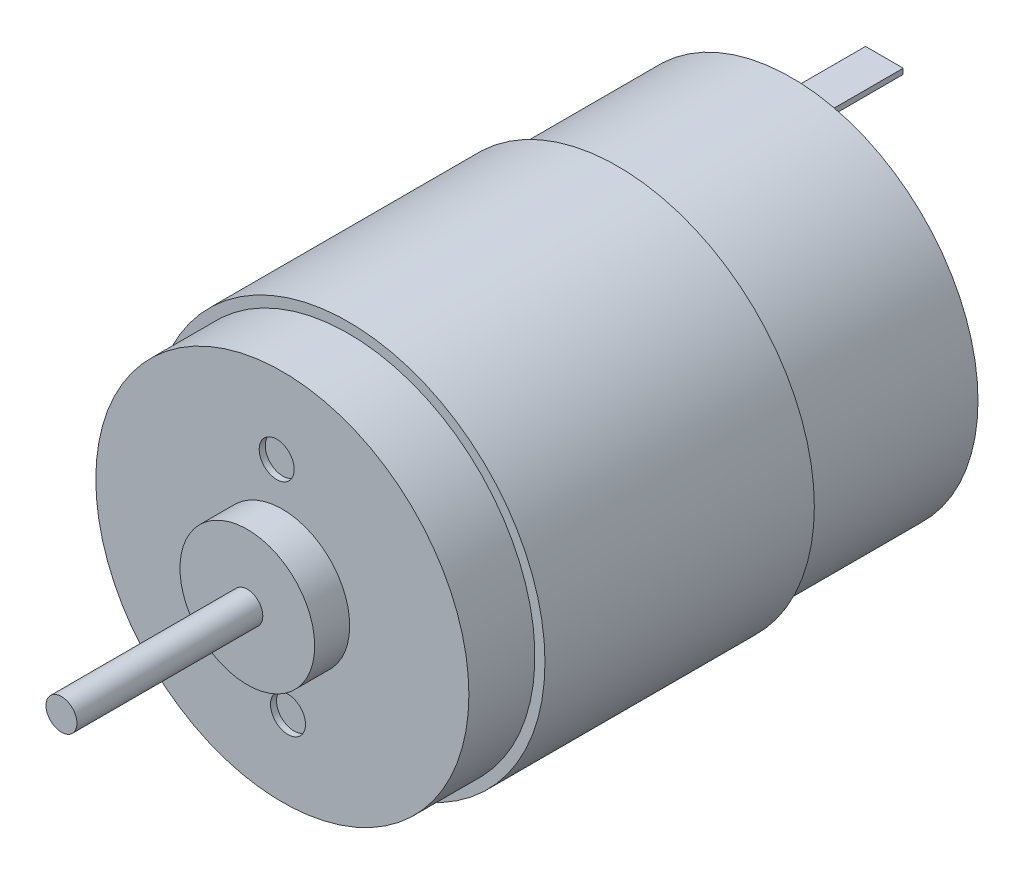
ISO-10303-21;
HEADER;
FILE_DESCRIPTION(('STEP AP214'),'2;1');
FILE_NAME('part.step','',(''),(''),'','','');
FILE_SCHEMA(('AUTOMOTIVE_DESIGN { 1 0 10303 214 1 1 1 1 }'));
ENDSEC;
DATA;
#1=APPLICATION_CONTEXT('core data for automotive mechanical design processes');
#2=APPLICATION_PROTOCOL_DEFINITION('international standard','automotive_design',2000,#1);
#3=PRODUCT_CONTEXT('',#1,'mechanical');
#4=PRODUCT('Part','Part','',(#3));
#5=PRODUCT_RELATED_PRODUCT_CATEGORY('part','',(#4));
#6=PRODUCT_DEFINITION_FORMATION('','',#4);
#7=PRODUCT_DEFINITION_CONTEXT('part definition',#1,'design');
#8=PRODUCT_DEFINITION('design','',#6,#7);
#9=PRODUCT_DEFINITION_SHAPE('','',#8);
#10=(LENGTH_UNIT() NAMED_UNIT(*) SI_UNIT(.MILLI.,.METRE.));
#11=(NAMED_UNIT(*) PLANE_ANGLE_UNIT() SI_UNIT($,.RADIAN.));
#12=(NAMED_UNIT(*) SI_UNIT($,.STERADIAN.) SOLID_ANGLE_UNIT());
#13=UNCERTAINTY_MEASURE_WITH_UNIT(LENGTH_MEASURE(1.E-05),#10,'distance_accuracy_value','');
#14=(GEOMETRIC_REPRESENTATION_CONTEXT(3) GLOBAL_UNCERTAINTY_ASSIGNED_CONTEXT((#13)) GLOBAL_UNIT_ASSIGNED_CONTEXT((#10,
#11,#12)) REPRESENTATION_CONTEXT('',''));
#15=CARTESIAN_POINT('',(0.,0.,0.));
#16=DIRECTION('',(0.,0.,1.));
#17=DIRECTION('',(1.,0.,0.));
#18=AXIS2_PLACEMENT_3D('',#15,#16,#17);
#19=CARTESIAN_POINT('',(0.,0.,0.));
#20=DIRECTION('',(0.,0.,1.));
#21=DIRECTION('',(1.,0.,0.));
#22=AXIS2_PLACEMENT_3D('',#19,#20,#21);
#23=PLANE('',#22);
#24=DIRECTION('',(0.,-1.,0.));
#25=VECTOR('',#24,1.);
#26=CARTESIAN_POINT('',(1.40000000000001,11.7,0.));
#27=LINE('',#26,#25);
#28=CARTESIAN_POINT('',(1.40000000000001,11.7,0.));
#29=VERTEX_POINT('',#28);
#30=CARTESIAN_POINT('',(1.40000000000001,11.3,0.));
#31=VERTEX_POINT('',#30);
#32=EDGE_CURVE('E121',#29,#31,#27,.T.);
#33=ORIENTED_EDGE('',*,*,#32,.F.);
#34=DIRECTION('',(1.,0.,0.));
#35=VECTOR('',#34,1.);
#36=CARTESIAN_POINT('',(1.40000000000001,11.7,0.));
#37=LINE('',#36,#35);
#38=CARTESIAN_POINT('',(-1.39999999999999,11.7,0.));
#39=VERTEX_POINT('',#38);
#40=EDGE_CURVE('E134',#39,#29,#37,.T.);
#41=ORIENTED_EDGE('',*,*,#40,.F.);
#42=DIRECTION('',(0.,1.,0.));
#43=VECTOR('',#42,1.);
#44=CARTESIAN_POINT('',(-1.39999999999999,11.7,0.));
#45=LINE('',#44,#43);
#46=CARTESIAN_POINT('',(-1.39999999999999,11.3,0.));
#47=VERTEX_POINT('',#46);
#48=EDGE_CURVE('E143',#47,#39,#45,.T.);
#49=ORIENTED_EDGE('',*,*,#48,.F.);
#50=DIRECTION('',(-1.,0.,0.));
#51=VECTOR('',#50,1.);
#52=CARTESIAN_POINT('',(1.40000000000001,11.3,0.));
#53=LINE('',#52,#51);
#54=EDGE_CURVE('E124',#31,#47,#53,.T.);
#55=ORIENTED_EDGE('',*,*,#54,.F.);
#56=EDGE_LOOP('',(#33,#41,#49,#55));
#57=FACE_BOUND('',#56,.T.);
#58=CARTESIAN_POINT('',(0.,0.,0.));
#59=DIRECTION('',(0.,0.,-1.));
#60=DIRECTION('',(-1.,0.,0.));
#61=AXIS2_PLACEMENT_3D('',#58,#59,#60);
#62=CIRCLE('',#61,5.);
#63=CARTESIAN_POINT('',(-5.,0.,0.));
#64=VERTEX_POINT('',#63);
#65=EDGE_CURVE('E11',#64,#64,#62,.T.);
#66=ORIENTED_EDGE('',*,*,#65,.F.);
#67=EDGE_LOOP('',(#66));
#68=FACE_BOUND('',#67,.T.);
#69=CARTESIAN_POINT('',(0.,0.,0.));
#70=DIRECTION('',(0.,0.,1.));
#71=DIRECTION('',(1.,0.,0.));
#72=AXIS2_PLACEMENT_3D('',#69,#70,#71);
#73=CIRCLE('',#72,13.85);
#74=CARTESIAN_POINT('',(13.85,0.,0.));
#75=VERTEX_POINT('',#74);
#76=EDGE_CURVE('E175',#75,#75,#73,.T.);
#77=ORIENTED_EDGE('',*,*,#76,.F.);
#78=EDGE_LOOP('',(#77));
#79=FACE_BOUND('',#78,.T.);
#80=DIRECTION('',(0.,-1.,0.));
#81=VECTOR('',#80,1.);
#82=CARTESIAN_POINT('',(1.4,-11.7,0.));
#83=LINE('',#82,#81);
#84=CARTESIAN_POINT('',(1.4,-11.3,0.));
#85=VERTEX_POINT('',#84);
#86=CARTESIAN_POINT('',(1.4,-11.7,0.));
#87=VERTEX_POINT('',#86);
#88=EDGE_CURVE('E120',#85,#87,#83,.T.);
#89=ORIENTED_EDGE('',*,*,#88,.F.);
#90=DIRECTION('',(1.,0.,0.));
#91=VECTOR('',#90,1.);
#92=CARTESIAN_POINT('',(1.4,-11.3,0.));
#93=LINE('',#92,#91);
#94=CARTESIAN_POINT('',(-1.4,-11.3,0.));
#95=VERTEX_POINT('',#94);
#96=EDGE_CURVE('E117',#95,#85,#93,.T.);
#97=ORIENTED_EDGE('',*,*,#96,.F.);
#98=DIRECTION('',(0.,1.,0.));
#99=VECTOR('',#98,1.);
#100=CARTESIAN_POINT('',(-1.4,-11.7,0.));
#101=LINE('',#100,#99);
#102=CARTESIAN_POINT('',(-1.4,-11.7,0.));
#103=VERTEX_POINT('',#102);
#104=EDGE_CURVE('E55',#103,#95,#101,.T.);
#105=ORIENTED_EDGE('',*,*,#104,.F.);
#106=DIRECTION('',(-1.,0.,0.));
#107=VECTOR('',#106,1.);
#108=CARTESIAN_POINT('',(1.4,-11.7,0.));
#109=LINE('',#108,#107);
#110=EDGE_CURVE('E50',#87,#103,#109,.T.);
#111=ORIENTED_EDGE('',*,*,#110,.F.);
#112=EDGE_LOOP('',(#89,#97,#105,#111));
#113=FACE_BOUND('',#112,.T.);
#114=ADVANCED_FACE('F33',(#57,#68,#79,#113),#23,.F.);
#115=CARTESIAN_POINT('',(0.,0.,37.8));
#116=DIRECTION('',(0.,0.,-1.));
#117=DIRECTION('',(-1.,0.,0.));
#118=AXIS2_PLACEMENT_3D('',#115,#116,#117);
#119=CYLINDRICAL_SURFACE('',#118,13.85);
#120=CARTESIAN_POINT('',(0.,0.,37.8));
#121=DIRECTION('',(0.,0.,1.));
#122=DIRECTION('',(1.,0.,0.));
#123=AXIS2_PLACEMENT_3D('',#120,#121,#122);
#124=CIRCLE('',#123,13.85);
#125=CARTESIAN_POINT('',(13.85,0.,37.8));
#126=VERTEX_POINT('',#125);
#127=EDGE_CURVE('E179',#126,#126,#124,.T.);
#128=ORIENTED_EDGE('',*,*,#127,.F.);
#129=EDGE_LOOP('',(#128));
#130=FACE_BOUND('',#129,.T.);
#131=CARTESIAN_POINT('',(0.,0.,32.9));
#132=DIRECTION('',(0.,0.,-1.));
#133=DIRECTION('',(-1.,0.,0.));
#134=AXIS2_PLACEMENT_3D('',#131,#132,#133);
#135=CIRCLE('',#134,13.85);
#136=CARTESIAN_POINT('',(-13.85,0.,32.9));
#137=VERTEX_POINT('',#136);
#138=EDGE_CURVE('E42',#137,#137,#135,.T.);
#139=ORIENTED_EDGE('',*,*,#138,.F.);
#140=EDGE_LOOP('',(#139));
#141=FACE_BOUND('',#140,.T.);
#142=ADVANCED_FACE('F191',(#130,#141),#119,.T.);
#143=CARTESIAN_POINT('',(0.,0.,37.8));
#144=DIRECTION('',(0.,0.,1.));
#145=DIRECTION('',(1.,0.,0.));
#146=AXIS2_PLACEMENT_3D('',#143,#144,#145);
#147=PLANE('',#146);
#148=CARTESIAN_POINT('',(-0.418687649943556,7.98903627803659,37.8));
#149=DIRECTION('',(0.,0.,1.));
#150=DIRECTION('',(1.,0.,0.));
#151=AXIS2_PLACEMENT_3D('',#148,#149,#150);
#152=CIRCLE('',#151,1.3);
#153=CARTESIAN_POINT('',(0.881312350056444,7.98903627803659,37.8));
#154=VERTEX_POINT('',#153);
#155=EDGE_CURVE('E242',#154,#154,#152,.T.);
#156=ORIENTED_EDGE('',*,*,#155,.F.);
#157=EDGE_LOOP('',(#156));
#158=FACE_BOUND('',#157,.T.);
#159=CARTESIAN_POINT('',(0.418687649943557,-7.98903627803659,37.8));
#160=DIRECTION('',(0.,0.,1.));
#161=DIRECTION('',(-1.,0.,0.));
#162=AXIS2_PLACEMENT_3D('',#159,#160,#161);
#163=CIRCLE('',#162,1.3);
#164=CARTESIAN_POINT('',(-0.881312350056447,-7.98903627803659,37.8));
#165=VERTEX_POINT('',#164);
#166=EDGE_CURVE('E236',#165,#165,#163,.T.);
#167=ORIENTED_EDGE('',*,*,#166,.F.);
#168=EDGE_LOOP('',(#167));
#169=FACE_BOUND('',#168,.T.);
#170=CARTESIAN_POINT('',(0.,0.,37.8));
#171=DIRECTION('',(0.,0.,1.));
#172=DIRECTION('',(1.,0.,0.));
#173=AXIS2_PLACEMENT_3D('',#170,#171,#172);
#174=CIRCLE('',#173,5.);
#175=CARTESIAN_POINT('',(5.,0.,37.8));
#176=VERTEX_POINT('',#175);
#177=EDGE_CURVE('E176',#176,#176,#174,.T.);
#178=ORIENTED_EDGE('',*,*,#177,.F.);
#179=EDGE_LOOP('',(#178));
#180=FACE_BOUND('',#179,.T.);
#181=ORIENTED_EDGE('',*,*,#127,.T.);
#182=EDGE_LOOP('',(#181));
#183=FACE_BOUND('',#182,.T.);
#184=ADVANCED_FACE('F193',(#158,#169,#180,#183),#147,.T.);
#185=CARTESIAN_POINT('',(0.,0.,40.4));
#186=DIRECTION('',(0.,0.,-1.));
#187=DIRECTION('',(-1.,0.,0.));
#188=AXIS2_PLACEMENT_3D('',#185,#186,#187);
#189=CYLINDRICAL_SURFACE('',#188,5.);
#190=CARTESIAN_POINT('',(0.,0.,40.4));
#191=DIRECTION('',(0.,0.,1.));
#192=DIRECTION('',(1.,0.,0.));
#193=AXIS2_PLACEMENT_3D('',#190,#191,#192);
#194=CIRCLE('',#193,5.);
#195=CARTESIAN_POINT('',(5.,0.,40.4));
#196=VERTEX_POINT('',#195);
#197=EDGE_CURVE('E172',#196,#196,#194,.T.);
#198=ORIENTED_EDGE('',*,*,#197,.F.);
#199=EDGE_LOOP('',(#198));
#200=FACE_BOUND('',#199,.T.);
#201=ORIENTED_EDGE('',*,*,#177,.T.);
#202=EDGE_LOOP('',(#201));
#203=FACE_BOUND('',#202,.T.);
#204=ADVANCED_FACE('F199',(#200,#203),#189,.T.);
#205=CARTESIAN_POINT('',(0.,0.,40.4));
#206=DIRECTION('',(0.,0.,1.));
#207=DIRECTION('',(1.,0.,0.));
#208=AXIS2_PLACEMENT_3D('',#205,#206,#207);
#209=PLANE('',#208);
#210=CARTESIAN_POINT('',(0.,0.,40.4));
#211=DIRECTION('',(0.,0.,1.));
#212=DIRECTION('',(1.,0.,0.));
#213=AXIS2_PLACEMENT_3D('',#210,#211,#212);
#214=CIRCLE('',#213,1.15);
#215=CARTESIAN_POINT('',(1.15,0.,40.4));
#216=VERTEX_POINT('',#215);
#217=EDGE_CURVE('E171',#216,#216,#214,.F.);
#218=ORIENTED_EDGE('',*,*,#217,.T.);
#219=EDGE_LOOP('',(#218));
#220=FACE_BOUND('',#219,.T.);
#221=ORIENTED_EDGE('',*,*,#197,.T.);
#222=EDGE_LOOP('',(#221));
#223=FACE_BOUND('',#222,.T.);
#224=ADVANCED_FACE('F263',(#220,#223),#209,.T.);
#225=CARTESIAN_POINT('',(0.,0.,54.2));
#226=DIRECTION('',(0.,0.,-1.));
#227=DIRECTION('',(-1.,0.,0.));
#228=AXIS2_PLACEMENT_3D('',#225,#226,#227);
#229=CYLINDRICAL_SURFACE('',#228,1.15);
#230=ORIENTED_EDGE('',*,*,#217,.F.);
#231=EDGE_LOOP('',(#230));
#232=FACE_BOUND('',#231,.T.);
#233=CARTESIAN_POINT('',(0.,0.,54.2));
#234=DIRECTION('',(0.,0.,1.));
#235=DIRECTION('',(1.,0.,0.));
#236=AXIS2_PLACEMENT_3D('',#233,#234,#235);
#237=CIRCLE('',#236,1.15);
#238=CARTESIAN_POINT('',(1.15,0.,54.2));
#239=VERTEX_POINT('',#238);
#240=EDGE_CURVE('E168',#239,#239,#237,.T.);
#241=ORIENTED_EDGE('',*,*,#240,.F.);
#242=EDGE_LOOP('',(#241));
#243=FACE_BOUND('',#242,.T.);
#244=ADVANCED_FACE('F269',(#232,#243),#229,.T.);
#245=CARTESIAN_POINT('',(0.,0.,54.2));
#246=DIRECTION('',(0.,0.,1.));
#247=DIRECTION('',(1.,0.,0.));
#248=AXIS2_PLACEMENT_3D('',#245,#246,#247);
#249=PLANE('',#248);
#250=ORIENTED_EDGE('',*,*,#240,.T.);
#251=EDGE_LOOP('',(#250));
#252=FACE_BOUND('',#251,.T.);
#253=ADVANCED_FACE('F276',(#252),#249,.T.);
#254=CARTESIAN_POINT('',(0.,0.,12.9));
#255=DIRECTION('',(0.,0.,1.));
#256=DIRECTION('',(1.,0.,0.));
#257=AXIS2_PLACEMENT_3D('',#254,#255,#256);
#258=CYLINDRICAL_SURFACE('',#257,14.6);
#259=CARTESIAN_POINT('',(0.,0.,12.9));
#260=DIRECTION('',(0.,0.,-1.));
#261=DIRECTION('',(-1.,0.,0.));
#262=AXIS2_PLACEMENT_3D('',#259,#260,#261);
#263=CIRCLE('',#262,14.6);
#264=CARTESIAN_POINT('',(-14.6,0.,12.9));
#265=VERTEX_POINT('',#264);
#266=EDGE_CURVE('E163',#265,#265,#263,.T.);
#267=ORIENTED_EDGE('',*,*,#266,.F.);
#268=EDGE_LOOP('',(#267));
#269=FACE_BOUND('',#268,.T.);
#270=CARTESIAN_POINT('',(0.,0.,32.9));
#271=DIRECTION('',(0.,0.,-1.));
#272=DIRECTION('',(-1.,0.,0.));
#273=AXIS2_PLACEMENT_3D('',#270,#271,#272);
#274=CIRCLE('',#273,14.6);
#275=CARTESIAN_POINT('',(-14.6,0.,32.9));
#276=VERTEX_POINT('',#275);
#277=EDGE_CURVE('E161',#276,#276,#274,.T.);
#278=ORIENTED_EDGE('',*,*,#277,.T.);
#279=EDGE_LOOP('',(#278));
#280=FACE_BOUND('',#279,.T.);
#281=ADVANCED_FACE('F280',(#269,#280),#258,.T.);
#282=CARTESIAN_POINT('',(0.,0.,12.9));
#283=DIRECTION('',(0.,0.,-1.));
#284=DIRECTION('',(-1.,0.,0.));
#285=AXIS2_PLACEMENT_3D('',#282,#283,#284);
#286=PLANE('',#285);
#287=CARTESIAN_POINT('',(0.,0.,12.9));
#288=DIRECTION('',(0.,0.,-1.));
#289=DIRECTION('',(-1.,0.,0.));
#290=AXIS2_PLACEMENT_3D('',#287,#288,#289);
#291=CIRCLE('',#290,13.85);
#292=CARTESIAN_POINT('',(-13.85,0.,12.9));
#293=VERTEX_POINT('',#292);
#294=EDGE_CURVE('E37',#293,#293,#291,.T.);
#295=ORIENTED_EDGE('',*,*,#294,.F.);
#296=EDGE_LOOP('',(#295));
#297=FACE_BOUND('',#296,.T.);
#298=ORIENTED_EDGE('',*,*,#266,.T.);
#299=EDGE_LOOP('',(#298));
#300=FACE_BOUND('',#299,.T.);
#301=ADVANCED_FACE('F214',(#297,#300),#286,.T.);
#302=CARTESIAN_POINT('',(0.,0.,32.9));
#303=DIRECTION('',(0.,0.,-1.));
#304=DIRECTION('',(-1.,0.,0.));
#305=AXIS2_PLACEMENT_3D('',#302,#303,#304);
#306=PLANE('',#305);
#307=ORIENTED_EDGE('',*,*,#138,.T.);
#308=EDGE_LOOP('',(#307));
#309=FACE_BOUND('',#308,.T.);
#310=ORIENTED_EDGE('',*,*,#277,.F.);
#311=EDGE_LOOP('',(#310));
#312=FACE_BOUND('',#311,.T.);
#313=ADVANCED_FACE('F188',(#309,#312),#306,.F.);
#314=ORIENTED_EDGE('',*,*,#294,.T.);
#315=EDGE_LOOP('',(#314));
#316=FACE_BOUND('',#315,.T.);
#317=ORIENTED_EDGE('',*,*,#76,.T.);
#318=EDGE_LOOP('',(#317));
#319=FACE_BOUND('',#318,.T.);
#320=ADVANCED_FACE('F35',(#316,#319),#119,.T.);
#321=CARTESIAN_POINT('',(0.,0.,-2.6));
#322=DIRECTION('',(0.,0.,1.));
#323=DIRECTION('',(1.,0.,0.));
#324=AXIS2_PLACEMENT_3D('',#321,#322,#323);
#325=CYLINDRICAL_SURFACE('',#324,5.);
#326=CARTESIAN_POINT('',(0.,0.,-2.6));
#327=DIRECTION('',(0.,0.,-1.));
#328=DIRECTION('',(-1.,0.,0.));
#329=AXIS2_PLACEMENT_3D('',#326,#327,#328);
#330=CIRCLE('',#329,5.);
#331=CARTESIAN_POINT('',(-5.,0.,-2.6));
#332=VERTEX_POINT('',#331);
#333=EDGE_CURVE('E159',#332,#332,#330,.T.);
#334=ORIENTED_EDGE('',*,*,#333,.F.);
#335=EDGE_LOOP('',(#334));
#336=FACE_BOUND('',#335,.T.);
#337=ORIENTED_EDGE('',*,*,#65,.T.);
#338=EDGE_LOOP('',(#337));
#339=FACE_BOUND('',#338,.T.);
#340=ADVANCED_FACE('F205',(#336,#339),#325,.T.);
#341=CARTESIAN_POINT('',(0.,0.,-2.6));
#342=DIRECTION('',(0.,0.,-1.));
#343=DIRECTION('',(-1.,0.,0.));
#344=AXIS2_PLACEMENT_3D('',#341,#342,#343);
#345=PLANE('',#344);
#346=ORIENTED_EDGE('',*,*,#333,.T.);
#347=EDGE_LOOP('',(#346));
#348=FACE_BOUND('',#347,.T.);
#349=ADVANCED_FACE('F211',(#348),#345,.T.);
#350=CARTESIAN_POINT('',(1.40000000000001,11.7,-6.9));
#351=DIRECTION('',(-1.,0.,0.));
#352=DIRECTION('',(0.,0.,1.));
#353=AXIS2_PLACEMENT_3D('',#350,#351,#352);
#354=PLANE('',#353);
#355=ORIENTED_EDGE('',*,*,#32,.T.);
#356=DIRECTION('',(0.,0.,1.));
#357=VECTOR('',#356,1.);
#358=CARTESIAN_POINT('',(1.40000000000001,11.3,-6.9));
#359=LINE('',#358,#357);
#360=CARTESIAN_POINT('',(1.40000000000001,11.3,-6.9));
#361=VERTEX_POINT('',#360);
#362=EDGE_CURVE('E156',#361,#31,#359,.T.);
#363=ORIENTED_EDGE('',*,*,#362,.F.);
#364=DIRECTION('',(0.,-1.,0.));
#365=VECTOR('',#364,1.);
#366=CARTESIAN_POINT('',(1.40000000000001,11.7,-6.9));
#367=LINE('',#366,#365);
#368=CARTESIAN_POINT('',(1.40000000000001,11.7,-6.9));
#369=VERTEX_POINT('',#368);
#370=EDGE_CURVE('E130',#369,#361,#367,.T.);
#371=ORIENTED_EDGE('',*,*,#370,.F.);
#372=DIRECTION('',(0.,0.,1.));
#373=VECTOR('',#372,1.);
#374=CARTESIAN_POINT('',(1.40000000000001,11.7,-6.9));
#375=LINE('',#374,#373);
#376=EDGE_CURVE('E139',#369,#29,#375,.T.);
#377=ORIENTED_EDGE('',*,*,#376,.T.);
#378=EDGE_LOOP('',(#355,#363,#371,#377));
#379=FACE_BOUND('',#378,.T.);
#380=ADVANCED_FACE('F290',(#379),#354,.F.);
#381=CARTESIAN_POINT('',(1.40000000000001,11.3,-6.9));
#382=DIRECTION('',(0.,1.,0.));
#383=DIRECTION('',(0.,0.,1.));
#384=AXIS2_PLACEMENT_3D('',#381,#382,#383);
#385=PLANE('',#384);
#386=ORIENTED_EDGE('',*,*,#54,.T.);
#387=DIRECTION('',(0.,0.,1.));
#388=VECTOR('',#387,1.);
#389=CARTESIAN_POINT('',(-1.39999999999999,11.3,-6.9));
#390=LINE('',#389,#388);
#391=CARTESIAN_POINT('',(-1.39999999999999,11.3,-6.9));
#392=VERTEX_POINT('',#391);
#393=EDGE_CURVE('E153',#392,#47,#390,.T.);
#394=ORIENTED_EDGE('',*,*,#393,.F.);
#395=DIRECTION('',(-1.,0.,0.));
#396=VECTOR('',#395,1.);
#397=CARTESIAN_POINT('',(1.40000000000001,11.3,-6.9));
#398=LINE('',#397,#396);
#399=EDGE_CURVE('E133',#361,#392,#398,.T.);
#400=ORIENTED_EDGE('',*,*,#399,.F.);
#401=ORIENTED_EDGE('',*,*,#362,.T.);
#402=EDGE_LOOP('',(#386,#394,#400,#401));
#403=FACE_BOUND('',#402,.T.);
#404=ADVANCED_FACE('F294',(#403),#385,.F.);
#405=CARTESIAN_POINT('',(-1.39999999999999,11.7,-6.9));
#406=DIRECTION('',(1.,0.,0.));
#407=DIRECTION('',(0.,0.,-1.));
#408=AXIS2_PLACEMENT_3D('',#405,#406,#407);
#409=PLANE('',#408);
#410=ORIENTED_EDGE('',*,*,#48,.T.);
#411=DIRECTION('',(0.,0.,1.));
#412=VECTOR('',#411,1.);
#413=CARTESIAN_POINT('',(-1.39999999999999,11.7,-6.9));
#414=LINE('',#413,#412);
#415=CARTESIAN_POINT('',(-1.39999999999999,11.7,-6.9));
#416=VERTEX_POINT('',#415);
#417=EDGE_CURVE('E150',#416,#39,#414,.T.);
#418=ORIENTED_EDGE('',*,*,#417,.F.);
#419=DIRECTION('',(0.,1.,0.));
#420=VECTOR('',#419,1.);
#421=CARTESIAN_POINT('',(-1.39999999999999,11.7,-6.9));
#422=LINE('',#421,#420);
#423=EDGE_CURVE('E136',#392,#416,#422,.T.);
#424=ORIENTED_EDGE('',*,*,#423,.F.);
#425=ORIENTED_EDGE('',*,*,#393,.T.);
#426=EDGE_LOOP('',(#410,#418,#424,#425));
#427=FACE_BOUND('',#426,.T.);
#428=ADVANCED_FACE('F298',(#427),#409,.F.);
#429=CARTESIAN_POINT('',(1.40000000000001,11.7,-6.9));
#430=DIRECTION('',(0.,-1.,0.));
#431=DIRECTION('',(0.,0.,-1.));
#432=AXIS2_PLACEMENT_3D('',#429,#430,#431);
#433=PLANE('',#432);
#434=ORIENTED_EDGE('',*,*,#40,.T.);
#435=ORIENTED_EDGE('',*,*,#376,.F.);
#436=DIRECTION('',(1.,0.,0.));
#437=VECTOR('',#436,1.);
#438=CARTESIAN_POINT('',(1.40000000000001,11.7,-6.9));
#439=LINE('',#438,#437);
#440=EDGE_CURVE('E138',#416,#369,#439,.T.);
#441=ORIENTED_EDGE('',*,*,#440,.F.);
#442=ORIENTED_EDGE('',*,*,#417,.T.);
#443=EDGE_LOOP('',(#434,#435,#441,#442));
#444=FACE_BOUND('',#443,.T.);
#445=ADVANCED_FACE('F302',(#444),#433,.F.);
#446=CARTESIAN_POINT('',(0.,0.,-6.9));
#447=DIRECTION('',(0.,0.,-1.));
#448=DIRECTION('',(-1.,0.,0.));
#449=AXIS2_PLACEMENT_3D('',#446,#447,#448);
#450=PLANE('',#449);
#451=ORIENTED_EDGE('',*,*,#370,.T.);
#452=ORIENTED_EDGE('',*,*,#399,.T.);
#453=ORIENTED_EDGE('',*,*,#423,.T.);
#454=ORIENTED_EDGE('',*,*,#440,.T.);
#455=EDGE_LOOP('',(#451,#452,#453,#454));
#456=FACE_BOUND('',#455,.T.);
#457=ADVANCED_FACE('F306',(#456),#450,.T.);
#458=CARTESIAN_POINT('',(1.4,-11.7,-6.9));
#459=DIRECTION('',(-1.,0.,0.));
#460=DIRECTION('',(0.,0.,1.));
#461=AXIS2_PLACEMENT_3D('',#458,#459,#460);
#462=PLANE('',#461);
#463=ORIENTED_EDGE('',*,*,#88,.T.);
#464=DIRECTION('',(0.,0.,1.));
#465=VECTOR('',#464,1.);
#466=CARTESIAN_POINT('',(1.4,-11.7,-6.9));
#467=LINE('',#466,#465);
#468=CARTESIAN_POINT('',(1.4,-11.7,-6.9));
#469=VERTEX_POINT('',#468);
#470=EDGE_CURVE('E101',#469,#87,#467,.T.);
#471=ORIENTED_EDGE('',*,*,#470,.F.);
#472=DIRECTION('',(0.,-1.,0.));
#473=VECTOR('',#472,1.);
#474=CARTESIAN_POINT('',(1.4,-11.7,-6.9));
#475=LINE('',#474,#473);
#476=CARTESIAN_POINT('',(1.4,-11.3,-6.9));
#477=VERTEX_POINT('',#476);
#478=EDGE_CURVE('E108',#477,#469,#475,.T.);
#479=ORIENTED_EDGE('',*,*,#478,.F.);
#480=DIRECTION('',(0.,0.,1.));
#481=VECTOR('',#480,1.);
#482=CARTESIAN_POINT('',(1.4,-11.3,-6.9));
#483=LINE('',#482,#481);
#484=EDGE_CURVE('E227',#477,#85,#483,.T.);
#485=ORIENTED_EDGE('',*,*,#484,.T.);
#486=EDGE_LOOP('',(#463,#471,#479,#485));
#487=FACE_BOUND('',#486,.T.);
#488=ADVANCED_FACE('F119',(#487),#462,.F.);
#489=CARTESIAN_POINT('',(1.4,-11.7,-6.9));
#490=DIRECTION('',(0.,1.,0.));
#491=DIRECTION('',(0.,0.,1.));
#492=AXIS2_PLACEMENT_3D('',#489,#490,#491);
#493=PLANE('',#492);
#494=ORIENTED_EDGE('',*,*,#110,.T.);
#495=DIRECTION('',(0.,0.,1.));
#496=VECTOR('',#495,1.);
#497=CARTESIAN_POINT('',(-1.4,-11.7,-6.9));
#498=LINE('',#497,#496);
#499=CARTESIAN_POINT('',(-1.4,-11.7,-6.9));
#500=VERTEX_POINT('',#499);
#501=EDGE_CURVE('E104',#500,#103,#498,.T.);
#502=ORIENTED_EDGE('',*,*,#501,.F.);
#503=DIRECTION('',(-1.,0.,0.));
#504=VECTOR('',#503,1.);
#505=CARTESIAN_POINT('',(1.4,-11.7,-6.9));
#506=LINE('',#505,#504);
#507=EDGE_CURVE('E97',#469,#500,#506,.T.);
#508=ORIENTED_EDGE('',*,*,#507,.F.);
#509=ORIENTED_EDGE('',*,*,#470,.T.);
#510=EDGE_LOOP('',(#494,#502,#508,#509));
#511=FACE_BOUND('',#510,.T.);
#512=ADVANCED_FACE('F99',(#511),#493,.F.);
#513=CARTESIAN_POINT('',(-1.4,-11.7,-6.9));
#514=DIRECTION('',(1.,0.,0.));
#515=DIRECTION('',(0.,0.,-1.));
#516=AXIS2_PLACEMENT_3D('',#513,#514,#515);
#517=PLANE('',#516);
#518=ORIENTED_EDGE('',*,*,#104,.T.);
#519=DIRECTION('',(0.,0.,1.));
#520=VECTOR('',#519,1.);
#521=CARTESIAN_POINT('',(-1.4,-11.3,-6.9));
#522=LINE('',#521,#520);
#523=CARTESIAN_POINT('',(-1.4,-11.3,-6.9));
#524=VERTEX_POINT('',#523);
#525=EDGE_CURVE('E126',#524,#95,#522,.T.);
#526=ORIENTED_EDGE('',*,*,#525,.F.);
#527=DIRECTION('',(0.,1.,0.));
#528=VECTOR('',#527,1.);
#529=CARTESIAN_POINT('',(-1.4,-11.7,-6.9));
#530=LINE('',#529,#528);
#531=EDGE_CURVE('E107',#500,#524,#530,.T.);
#532=ORIENTED_EDGE('',*,*,#531,.F.);
#533=ORIENTED_EDGE('',*,*,#501,.T.);
#534=EDGE_LOOP('',(#518,#526,#532,#533));
#535=FACE_BOUND('',#534,.T.);
#536=ADVANCED_FACE('F315',(#535),#517,.F.);
#537=CARTESIAN_POINT('',(1.4,-11.3,-6.9));
#538=DIRECTION('',(0.,-1.,0.));
#539=DIRECTION('',(0.,0.,-1.));
#540=AXIS2_PLACEMENT_3D('',#537,#538,#539);
#541=PLANE('',#540);
#542=ORIENTED_EDGE('',*,*,#96,.T.);
#543=ORIENTED_EDGE('',*,*,#484,.F.);
#544=DIRECTION('',(1.,0.,0.));
#545=VECTOR('',#544,1.);
#546=CARTESIAN_POINT('',(1.4,-11.3,-6.9));
#547=LINE('',#546,#545);
#548=EDGE_CURVE('E113',#524,#477,#547,.T.);
#549=ORIENTED_EDGE('',*,*,#548,.F.);
#550=ORIENTED_EDGE('',*,*,#525,.T.);
#551=EDGE_LOOP('',(#542,#543,#549,#550));
#552=FACE_BOUND('',#551,.T.);
#553=ADVANCED_FACE('F226',(#552),#541,.F.);
#554=CARTESIAN_POINT('',(0.,0.,-6.9));
#555=DIRECTION('',(0.,0.,1.));
#556=DIRECTION('',(1.,0.,0.));
#557=AXIS2_PLACEMENT_3D('',#554,#555,#556);
#558=PLANE('',#557);
#559=ORIENTED_EDGE('',*,*,#478,.T.);
#560=ORIENTED_EDGE('',*,*,#507,.T.);
#561=ORIENTED_EDGE('',*,*,#531,.T.);
#562=ORIENTED_EDGE('',*,*,#548,.T.);
#563=EDGE_LOOP('',(#559,#560,#561,#562));
#564=FACE_BOUND('',#563,.T.);
#565=ADVANCED_FACE('F111',(#564),#558,.F.);
#566=CARTESIAN_POINT('',(0.418687649943557,-7.98903627803659,37.35));
#567=DIRECTION('',(0.,0.,1.));
#568=DIRECTION('',(1.,0.,0.));
#569=AXIS2_PLACEMENT_3D('',#566,#567,#568);
#570=CYLINDRICAL_SURFACE('',#569,1.3);
#571=CARTESIAN_POINT('',(0.418687649943557,-7.98903627803659,37.35));
#572=DIRECTION('',(0.,0.,1.));
#573=DIRECTION('',(-1.,0.,0.));
#574=AXIS2_PLACEMENT_3D('',#571,#572,#573);
#575=CIRCLE('',#574,1.3);
#576=CARTESIAN_POINT('',(-0.881312350056447,-7.98903627803659,37.35));
#577=VERTEX_POINT('',#576);
#578=EDGE_CURVE('E239',#577,#577,#575,.T.);
#579=ORIENTED_EDGE('',*,*,#578,.F.);
#580=EDGE_LOOP('',(#579));
#581=FACE_BOUND('',#580,.T.);
#582=ORIENTED_EDGE('',*,*,#166,.T.);
#583=EDGE_LOOP('',(#582));
#584=FACE_BOUND('',#583,.T.);
#585=ADVANCED_FACE('F323',(#581,#584),#570,.F.);
#586=CARTESIAN_POINT('',(0.418687649943557,-7.98903627803659,37.35));
#587=DIRECTION('',(0.,0.,-1.));
#588=DIRECTION('',(-1.,0.,0.));
#589=AXIS2_PLACEMENT_3D('',#586,#587,#588);
#590=PLANE('',#589);
#591=ORIENTED_EDGE('',*,*,#578,.T.);
#592=EDGE_LOOP('',(#591));
#593=FACE_BOUND('',#592,.T.);
#594=ADVANCED_FACE('F253',(#593),#590,.F.);
#595=CARTESIAN_POINT('',(-0.418687649943556,7.98903627803659,37.35));
#596=DIRECTION('',(0.,0.,1.));
#597=DIRECTION('',(1.,0.,0.));
#598=AXIS2_PLACEMENT_3D('',#595,#596,#597);
#599=CYLINDRICAL_SURFACE('',#598,1.3);
#600=CARTESIAN_POINT('',(-0.418687649943556,7.98903627803659,37.35));
#601=DIRECTION('',(0.,0.,1.));
#602=DIRECTION('',(1.,0.,0.));
#603=AXIS2_PLACEMENT_3D('',#600,#601,#602);
#604=CIRCLE('',#603,1.3);
#605=CARTESIAN_POINT('',(0.881312350056444,7.98903627803659,37.35));
#606=VERTEX_POINT('',#605);
#607=EDGE_CURVE('E222',#606,#606,#604,.T.);
#608=ORIENTED_EDGE('',*,*,#607,.F.);
#609=EDGE_LOOP('',(#608));
#610=FACE_BOUND('',#609,.T.);
#611=ORIENTED_EDGE('',*,*,#155,.T.);
#612=EDGE_LOOP('',(#611));
#613=FACE_BOUND('',#612,.T.);
#614=ADVANCED_FACE('F250',(#610,#613),#599,.F.);
#615=CARTESIAN_POINT('',(-0.418687649943556,7.98903627803659,37.35));
#616=DIRECTION('',(0.,0.,1.));
#617=DIRECTION('',(1.,0.,0.));
#618=AXIS2_PLACEMENT_3D('',#615,#616,#617);
#619=PLANE('',#618);
#620=ORIENTED_EDGE('',*,*,#607,.T.);
#621=EDGE_LOOP('',(#620));
#622=FACE_BOUND('',#621,.T.);
#623=ADVANCED_FACE('F248',(#622),#619,.T.);
#624=CLOSED_SHELL('',(#114,#142,#184,#204,#224,#244,#253,#281,#301,#313,#320,#340,#349,#380,
#404,#428,#445,#457,#488,#512,#536,#553,#565,#585,#594,#614,#623));
#625=MANIFOLD_SOLID_BREP('B2',#624);
#626=ADVANCED_BREP_SHAPE_REPRESENTATION('',(#18,#625),#14);
#627=SHAPE_DEFINITION_REPRESENTATION(#9,#626);
ENDSEC;
END-ISO-10303-21;
